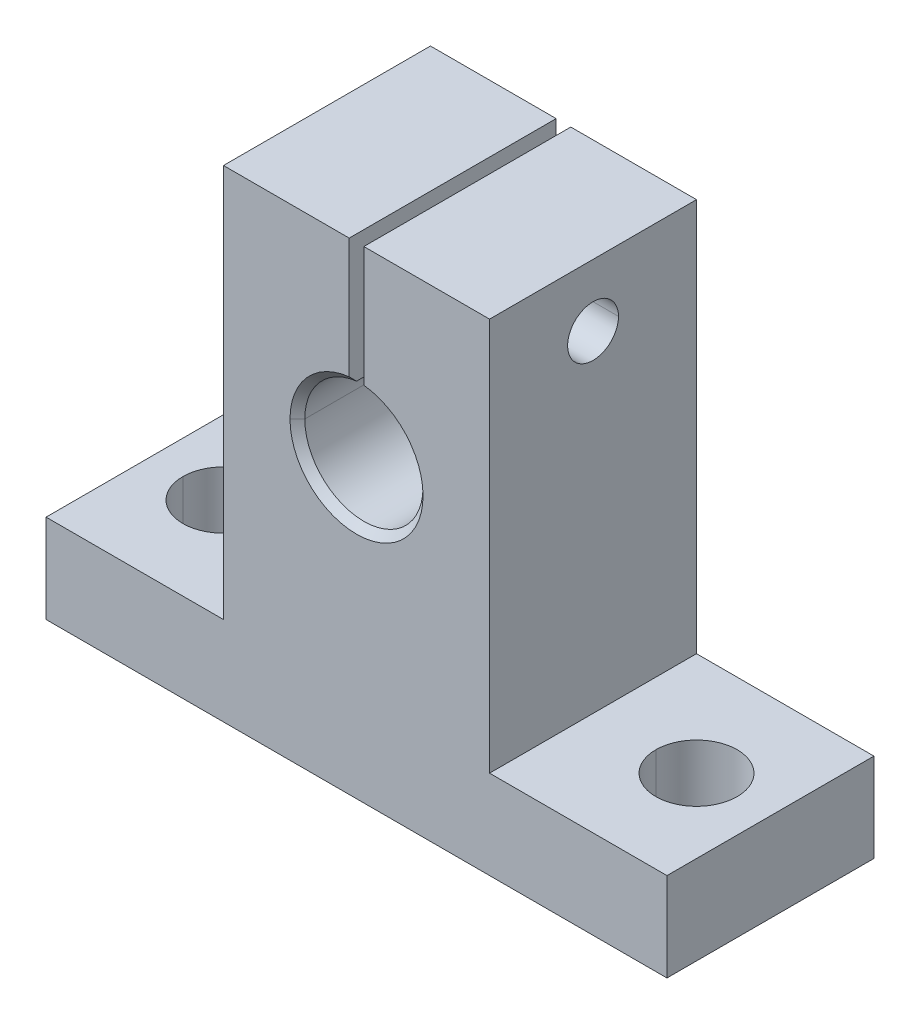
ISO-10303-21;
HEADER;
FILE_DESCRIPTION(('STEP AP214'),'2;1');
FILE_NAME('part.step','',(''),(''),'','','');
FILE_SCHEMA(('AUTOMOTIVE_DESIGN { 1 0 10303 214 1 1 1 1 }'));
ENDSEC;
DATA;
#1=APPLICATION_CONTEXT('core data for automotive mechanical design processes');
#2=APPLICATION_PROTOCOL_DEFINITION('international standard','automotive_design',2000,#1);
#3=PRODUCT_CONTEXT('',#1,'mechanical');
#4=PRODUCT('Part','Part','',(#3));
#5=PRODUCT_RELATED_PRODUCT_CATEGORY('part','',(#4));
#6=PRODUCT_DEFINITION_FORMATION('','',#4);
#7=PRODUCT_DEFINITION_CONTEXT('part definition',#1,'design');
#8=PRODUCT_DEFINITION('design','',#6,#7);
#9=PRODUCT_DEFINITION_SHAPE('','',#8);
#10=(LENGTH_UNIT() NAMED_UNIT(*) SI_UNIT(.MILLI.,.METRE.));
#11=(NAMED_UNIT(*) PLANE_ANGLE_UNIT() SI_UNIT($,.RADIAN.));
#12=(NAMED_UNIT(*) SI_UNIT($,.STERADIAN.) SOLID_ANGLE_UNIT());
#13=UNCERTAINTY_MEASURE_WITH_UNIT(LENGTH_MEASURE(1.E-05),#10,'distance_accuracy_value','');
#14=(GEOMETRIC_REPRESENTATION_CONTEXT(3) GLOBAL_UNCERTAINTY_ASSIGNED_CONTEXT((#13)) GLOBAL_UNIT_ASSIGNED_CONTEXT((#10,
#11,#12)) REPRESENTATION_CONTEXT('',''));
#15=CARTESIAN_POINT('',(0.,0.,0.));
#16=DIRECTION('',(0.,0.,1.));
#17=DIRECTION('',(1.,0.,0.));
#18=AXIS2_PLACEMENT_3D('',#15,#16,#17);
#19=CARTESIAN_POINT('',(0.,1.4,7.));
#20=DIRECTION('',(0.,0.,1.));
#21=DIRECTION('',(1.,0.,0.));
#22=AXIS2_PLACEMENT_3D('',#19,#20,#21);
#23=CONICAL_SURFACE('',#22,4.5,0.785398163397448);
#24=DIRECTION('',(-0.707106781186548,0.,0.707106781186548));
#25=VECTOR('',#24,1.);
#26=CARTESIAN_POINT('',(-4.5,1.4,7.));
#27=LINE('',#26,#25);
#28=CARTESIAN_POINT('',(-4.,1.4,6.5));
#29=VERTEX_POINT('',#28);
#30=CARTESIAN_POINT('',(-4.5,1.4,7.));
#31=VERTEX_POINT('',#30);
#32=EDGE_CURVE('E366',#29,#31,#27,.T.);
#33=ORIENTED_EDGE('',*,*,#32,.F.);
#34=CARTESIAN_POINT('',(0.,1.4,6.5));
#35=DIRECTION('',(0.,0.,1.));
#36=DIRECTION('',(1.,0.,0.));
#37=AXIS2_PLACEMENT_3D('',#34,#35,#36);
#38=CIRCLE('',#37,4.);
#39=CARTESIAN_POINT('',(-0.495,5.36925370819251,6.5));
#40=VERTEX_POINT('',#39);
#41=EDGE_CURVE('E350',#40,#29,#38,.T.);
#42=ORIENTED_EDGE('',*,*,#41,.F.);
#43=CARTESIAN_POINT('',(-0.495,5.87269214232322,7.));
#44=CARTESIAN_POINT('',(-0.495,5.70494321109334,6.83326903853444));
#45=CARTESIAN_POINT('',(-0.495,5.53713841340918,6.66659424718253));
#46=CARTESIAN_POINT('',(-0.495,5.36925370819251,6.5));
#47=(BOUNDED_CURVE() B_SPLINE_CURVE(3,(#43,#44,#45,#46),.UNSPECIFIED.,.F.,
.F.) B_SPLINE_CURVE_WITH_KNOTS((4,4),(0.,0.000709542286942768),
.UNSPECIFIED.) CURVE() GEOMETRIC_REPRESENTATION_ITEM() RATIONAL_B_SPLINE_CURVE((1.,1.,1.,1.)) REPRESENTATION_ITEM(''));
#48=CARTESIAN_POINT('',(-0.495,5.87269214232322,7.));
#49=VERTEX_POINT('',#48);
#50=EDGE_CURVE('E352',#49,#40,#47,.T.);
#51=ORIENTED_EDGE('',*,*,#50,.F.);
#52=CARTESIAN_POINT('',(0.,1.4,7.));
#53=DIRECTION('',(0.,0.,-1.));
#54=DIRECTION('',(1.,0.,0.));
#55=AXIS2_PLACEMENT_3D('',#52,#53,#54);
#56=CIRCLE('',#55,4.5);
#57=EDGE_CURVE('E44',#31,#49,#56,.T.);
#58=ORIENTED_EDGE('',*,*,#57,.F.);
#59=EDGE_LOOP('',(#33,#42,#51,#58));
#60=FACE_BOUND('',#59,.T.);
#61=ADVANCED_FACE('F16',(#60),#23,.F.);
#62=CARTESIAN_POINT('',(0.,1.4,-6.5));
#63=DIRECTION('',(0.,0.,-1.));
#64=DIRECTION('',(-1.,0.,0.));
#65=AXIS2_PLACEMENT_3D('',#62,#63,#64);
#66=CONICAL_SURFACE('',#65,4.,0.785398163397448);
#67=DIRECTION('',(0.707106781186548,0.,-0.707106781186548));
#68=VECTOR('',#67,1.);
#69=CARTESIAN_POINT('',(4.,1.4,-6.5));
#70=LINE('',#69,#68);
#71=CARTESIAN_POINT('',(4.,1.4,-6.5));
#72=VERTEX_POINT('',#71);
#73=CARTESIAN_POINT('',(4.5,1.4,-7.));
#74=VERTEX_POINT('',#73);
#75=EDGE_CURVE('E411',#72,#74,#70,.T.);
#76=ORIENTED_EDGE('',*,*,#75,.F.);
#77=CARTESIAN_POINT('',(0.,1.4,-6.5));
#78=DIRECTION('',(0.,0.,-1.));
#79=DIRECTION('',(1.,0.,0.));
#80=AXIS2_PLACEMENT_3D('',#77,#78,#79);
#81=CIRCLE('',#80,4.);
#82=CARTESIAN_POINT('',(0.495,5.36925370819251,-6.5));
#83=VERTEX_POINT('',#82);
#84=EDGE_CURVE('E345',#83,#72,#81,.T.);
#85=ORIENTED_EDGE('',*,*,#84,.F.);
#86=CARTESIAN_POINT('',(0.495,5.87269214232323,-7.));
#87=CARTESIAN_POINT('',(0.495,5.70494321109335,-6.83326903853444));
#88=CARTESIAN_POINT('',(0.495,5.53713841340918,-6.66659424718252));
#89=CARTESIAN_POINT('',(0.495,5.36925370819251,-6.5));
#90=(BOUNDED_CURVE() B_SPLINE_CURVE(3,(#86,#87,#88,#89),.UNSPECIFIED.,.F.,
.F.) B_SPLINE_CURVE_WITH_KNOTS((4,4),(0.,0.000709542286942788),
.UNSPECIFIED.) CURVE() GEOMETRIC_REPRESENTATION_ITEM() RATIONAL_B_SPLINE_CURVE((1.,1.,1.,1.)) REPRESENTATION_ITEM(''));
#91=CARTESIAN_POINT('',(0.495,5.87269214232323,-7.));
#92=VERTEX_POINT('',#91);
#93=EDGE_CURVE('E472',#92,#83,#90,.T.);
#94=ORIENTED_EDGE('',*,*,#93,.F.);
#95=CARTESIAN_POINT('',(0.,1.4,-7.));
#96=DIRECTION('',(0.,0.,1.));
#97=DIRECTION('',(1.,0.,0.));
#98=AXIS2_PLACEMENT_3D('',#95,#96,#97);
#99=CIRCLE('',#98,4.5);
#100=EDGE_CURVE('E486',#74,#92,#99,.T.);
#101=ORIENTED_EDGE('',*,*,#100,.F.);
#102=EDGE_LOOP('',(#76,#85,#94,#101));
#103=FACE_BOUND('',#102,.T.);
#104=ADVANCED_FACE('F615',(#103),#66,.F.);
#105=CARTESIAN_POINT('',(16.,-18.601,0.));
#106=DIRECTION('',(0.,1.,0.));
#107=DIRECTION('',(-1.,0.,0.));
#108=AXIS2_PLACEMENT_3D('',#105,#106,#107);
#109=CYLINDRICAL_SURFACE('',#108,2.75);
#110=DIRECTION('',(0.,1.,0.));
#111=VECTOR('',#110,1.);
#112=CARTESIAN_POINT('',(18.75,-18.601,0.));
#113=LINE('',#112,#111);
#114=CARTESIAN_POINT('',(18.75,-18.6,0.));
#115=VERTEX_POINT('',#114);
#116=CARTESIAN_POINT('',(18.75,-12.6,0.));
#117=VERTEX_POINT('',#116);
#118=EDGE_CURVE('E379',#115,#117,#113,.T.);
#119=ORIENTED_EDGE('',*,*,#118,.F.);
#120=CARTESIAN_POINT('',(16.,-18.6,0.));
#121=DIRECTION('',(0.,-1.,0.));
#122=DIRECTION('',(0.,0.,1.));
#123=AXIS2_PLACEMENT_3D('',#120,#121,#122);
#124=CIRCLE('',#123,2.75);
#125=CARTESIAN_POINT('',(13.25,-18.6,0.));
#126=VERTEX_POINT('',#125);
#127=EDGE_CURVE('E93',#115,#126,#124,.T.);
#128=ORIENTED_EDGE('',*,*,#127,.T.);
#129=DIRECTION('',(0.,1.,0.));
#130=VECTOR('',#129,1.);
#131=CARTESIAN_POINT('',(13.25,-18.601,0.));
#132=LINE('',#131,#130);
#133=CARTESIAN_POINT('',(13.25,-12.6,0.));
#134=VERTEX_POINT('',#133);
#135=EDGE_CURVE('E532',#126,#134,#132,.T.);
#136=ORIENTED_EDGE('',*,*,#135,.T.);
#137=CARTESIAN_POINT('',(16.,-12.6,0.));
#138=DIRECTION('',(0.,1.,0.));
#139=DIRECTION('',(1.,0.,0.));
#140=AXIS2_PLACEMENT_3D('',#137,#138,#139);
#141=CIRCLE('',#140,2.75);
#142=EDGE_CURVE('E77',#134,#117,#141,.T.);
#143=ORIENTED_EDGE('',*,*,#142,.T.);
#144=EDGE_LOOP('',(#119,#128,#136,#143));
#145=FACE_BOUND('',#144,.T.);
#146=ADVANCED_FACE('F1119',(#145),#109,.F.);
#147=CARTESIAN_POINT('',(-16.,-18.601,0.));
#148=DIRECTION('',(0.,1.,0.));
#149=DIRECTION('',(-1.,0.,0.));
#150=AXIS2_PLACEMENT_3D('',#147,#148,#149);
#151=CYLINDRICAL_SURFACE('',#150,2.75);
#152=DIRECTION('',(0.,1.,0.));
#153=VECTOR('',#152,1.);
#154=CARTESIAN_POINT('',(-13.25,-18.601,0.));
#155=LINE('',#154,#153);
#156=CARTESIAN_POINT('',(-13.25,-18.6,0.));
#157=VERTEX_POINT('',#156);
#158=CARTESIAN_POINT('',(-13.25,-12.6,0.));
#159=VERTEX_POINT('',#158);
#160=EDGE_CURVE('E303',#157,#159,#155,.T.);
#161=ORIENTED_EDGE('',*,*,#160,.F.);
#162=CARTESIAN_POINT('',(-16.,-18.6,0.));
#163=DIRECTION('',(0.,-1.,0.));
#164=DIRECTION('',(0.,0.,1.));
#165=AXIS2_PLACEMENT_3D('',#162,#163,#164);
#166=CIRCLE('',#165,2.75);
#167=CARTESIAN_POINT('',(-18.75,-18.6,0.));
#168=VERTEX_POINT('',#167);
#169=EDGE_CURVE('E295',#157,#168,#166,.T.);
#170=ORIENTED_EDGE('',*,*,#169,.T.);
#171=DIRECTION('',(0.,1.,0.));
#172=VECTOR('',#171,1.);
#173=CARTESIAN_POINT('',(-18.75,-18.601,0.));
#174=LINE('',#173,#172);
#175=CARTESIAN_POINT('',(-18.75,-12.6,0.));
#176=VERTEX_POINT('',#175);
#177=EDGE_CURVE('E293',#168,#176,#174,.T.);
#178=ORIENTED_EDGE('',*,*,#177,.T.);
#179=CARTESIAN_POINT('',(-16.,-12.6,0.));
#180=DIRECTION('',(0.,1.,0.));
#181=DIRECTION('',(-1.,0.,0.));
#182=AXIS2_PLACEMENT_3D('',#179,#180,#181);
#183=CIRCLE('',#182,2.75);
#184=EDGE_CURVE('E279',#176,#159,#183,.T.);
#185=ORIENTED_EDGE('',*,*,#184,.T.);
#186=EDGE_LOOP('',(#161,#170,#178,#185));
#187=FACE_BOUND('',#186,.T.);
#188=ADVANCED_FACE('F294',(#187),#151,.F.);
#189=CARTESIAN_POINT('',(-4.34108074635992,9.8,0.));
#190=DIRECTION('',(-1.,0.,0.));
#191=DIRECTION('',(0.,0.,1.));
#192=AXIS2_PLACEMENT_3D('',#189,#190,#191);
#193=CYLINDRICAL_SURFACE('',#192,1.72);
#194=DIRECTION('',(-1.,0.,0.));
#195=VECTOR('',#194,1.);
#196=CARTESIAN_POINT('',(-4.34108074635992,9.8,-1.72));
#197=LINE('',#196,#195);
#198=CARTESIAN_POINT('',(9.,9.8,-1.72));
#199=VERTEX_POINT('',#198);
#200=CARTESIAN_POINT('',(0.495,9.8,-1.72));
#201=VERTEX_POINT('',#200);
#202=EDGE_CURVE('E510',#199,#201,#197,.T.);
#203=ORIENTED_EDGE('',*,*,#202,.F.);
#204=CARTESIAN_POINT('',(9.,9.8,0.));
#205=DIRECTION('',(-1.,0.,0.));
#206=DIRECTION('',(0.,0.,1.));
#207=AXIS2_PLACEMENT_3D('',#204,#205,#206);
#208=CIRCLE('',#207,1.72);
#209=CARTESIAN_POINT('',(9.,9.8,1.72));
#210=VERTEX_POINT('',#209);
#211=EDGE_CURVE('E190',#210,#199,#208,.T.);
#212=ORIENTED_EDGE('',*,*,#211,.F.);
#213=DIRECTION('',(-1.,0.,0.));
#214=VECTOR('',#213,1.);
#215=CARTESIAN_POINT('',(-4.34108074635992,9.8,1.72));
#216=LINE('',#215,#214);
#217=CARTESIAN_POINT('',(0.495,9.8,1.72));
#218=VERTEX_POINT('',#217);
#219=EDGE_CURVE('E402',#210,#218,#216,.T.);
#220=ORIENTED_EDGE('',*,*,#219,.T.);
#221=CARTESIAN_POINT('',(0.495,9.8,0.));
#222=DIRECTION('',(1.,0.,0.));
#223=DIRECTION('',(0.,0.,-1.));
#224=AXIS2_PLACEMENT_3D('',#221,#222,#223);
#225=CIRCLE('',#224,1.72);
#226=EDGE_CURVE('E178',#201,#218,#225,.T.);
#227=ORIENTED_EDGE('',*,*,#226,.F.);
#228=EDGE_LOOP('',(#203,#212,#220,#227));
#229=FACE_BOUND('',#228,.T.);
#230=ADVANCED_FACE('F1118',(#229),#193,.F.);
#231=CARTESIAN_POINT('',(-4.34108074635992,9.8,0.));
#232=DIRECTION('',(-1.,0.,0.));
#233=DIRECTION('',(0.,0.,1.));
#234=AXIS2_PLACEMENT_3D('',#231,#232,#233);
#235=CYLINDRICAL_SURFACE('',#234,1.72);
#236=DIRECTION('',(-1.,0.,0.));
#237=VECTOR('',#236,1.);
#238=CARTESIAN_POINT('',(-4.34108074635992,9.8,-1.72));
#239=LINE('',#238,#237);
#240=CARTESIAN_POINT('',(-0.495,9.8,-1.72));
#241=VERTEX_POINT('',#240);
#242=CARTESIAN_POINT('',(-5.,9.8,-1.72));
#243=VERTEX_POINT('',#242);
#244=EDGE_CURVE('E401',#241,#243,#239,.T.);
#245=ORIENTED_EDGE('',*,*,#244,.F.);
#246=CARTESIAN_POINT('',(-0.495,9.8,0.));
#247=DIRECTION('',(-1.,0.,0.));
#248=DIRECTION('',(0.,0.,1.));
#249=AXIS2_PLACEMENT_3D('',#246,#247,#248);
#250=CIRCLE('',#249,1.72);
#251=CARTESIAN_POINT('',(-0.495,9.8,1.72));
#252=VERTEX_POINT('',#251);
#253=EDGE_CURVE('E357',#252,#241,#250,.T.);
#254=ORIENTED_EDGE('',*,*,#253,.F.);
#255=DIRECTION('',(-1.,0.,0.));
#256=VECTOR('',#255,1.);
#257=CARTESIAN_POINT('',(-4.34108074635992,9.8,1.72));
#258=LINE('',#257,#256);
#259=CARTESIAN_POINT('',(-5.,9.8,1.72));
#260=VERTEX_POINT('',#259);
#261=EDGE_CURVE('E316',#252,#260,#258,.T.);
#262=ORIENTED_EDGE('',*,*,#261,.T.);
#263=CARTESIAN_POINT('',(-5.,9.8,0.));
#264=DIRECTION('',(-1.,0.,0.));
#265=DIRECTION('',(0.,0.,1.));
#266=AXIS2_PLACEMENT_3D('',#263,#264,#265);
#267=CIRCLE('',#266,1.72);
#268=EDGE_CURVE('E10',#260,#243,#267,.T.);
#269=ORIENTED_EDGE('',*,*,#268,.T.);
#270=EDGE_LOOP('',(#245,#254,#262,#269));
#271=FACE_BOUND('',#270,.T.);
#272=ADVANCED_FACE('F1159',(#271),#235,.F.);
#273=CARTESIAN_POINT('',(-5.,0.,0.));
#274=DIRECTION('',(1.,0.,0.));
#275=DIRECTION('',(0.,1.,0.));
#276=AXIS2_PLACEMENT_3D('',#273,#274,#275);
#277=PLANE('',#276);
#278=ORIENTED_EDGE('',*,*,#268,.F.);
#279=CARTESIAN_POINT('',(-5.,9.8,0.));
#280=DIRECTION('',(-1.,0.,0.));
#281=DIRECTION('',(0.,0.,1.));
#282=AXIS2_PLACEMENT_3D('',#279,#280,#281);
#283=CIRCLE('',#282,1.72);
#284=EDGE_CURVE('E321',#243,#260,#283,.T.);
#285=ORIENTED_EDGE('',*,*,#284,.F.);
#286=EDGE_LOOP('',(#278,#285));
#287=FACE_BOUND('',#286,.T.);
#288=CARTESIAN_POINT('',(-5.,9.8,0.));
#289=DIRECTION('',(-1.,0.,0.));
#290=DIRECTION('',(0.,0.,1.));
#291=AXIS2_PLACEMENT_3D('',#288,#289,#290);
#292=CIRCLE('',#291,3.2);
#293=CARTESIAN_POINT('',(-5.,9.8,3.2));
#294=VERTEX_POINT('',#293);
#295=CARTESIAN_POINT('',(-5.,9.8,-3.2));
#296=VERTEX_POINT('',#295);
#297=EDGE_CURVE('E29',#294,#296,#292,.T.);
#298=ORIENTED_EDGE('',*,*,#297,.T.);
#299=CARTESIAN_POINT('',(-5.,9.8,0.));
#300=DIRECTION('',(-1.,0.,0.));
#301=DIRECTION('',(0.,0.,1.));
#302=AXIS2_PLACEMENT_3D('',#299,#300,#301);
#303=CIRCLE('',#302,3.2);
#304=EDGE_CURVE('E320',#296,#294,#303,.T.);
#305=ORIENTED_EDGE('',*,*,#304,.T.);
#306=EDGE_LOOP('',(#298,#305));
#307=FACE_BOUND('',#306,.T.);
#308=ADVANCED_FACE('F1045',(#287,#307),#277,.F.);
#309=CARTESIAN_POINT('',(-4.34108074635992,9.8,0.));
#310=DIRECTION('',(-1.,0.,0.));
#311=DIRECTION('',(0.,0.,1.));
#312=AXIS2_PLACEMENT_3D('',#309,#310,#311);
#313=CYLINDRICAL_SURFACE('',#312,3.2);
#314=DIRECTION('',(-1.,0.,0.));
#315=VECTOR('',#314,1.);
#316=CARTESIAN_POINT('',(-4.34108074635992,9.8,-3.2));
#317=LINE('',#316,#315);
#318=CARTESIAN_POINT('',(-9.,9.8,-3.2));
#319=VERTEX_POINT('',#318);
#320=EDGE_CURVE('E461',#296,#319,#317,.T.);
#321=ORIENTED_EDGE('',*,*,#320,.F.);
#322=ORIENTED_EDGE('',*,*,#297,.F.);
#323=DIRECTION('',(-1.,0.,0.));
#324=VECTOR('',#323,1.);
#325=CARTESIAN_POINT('',(-4.34108074635992,9.8,3.2));
#326=LINE('',#325,#324);
#327=CARTESIAN_POINT('',(-9.,9.8,3.2));
#328=VERTEX_POINT('',#327);
#329=EDGE_CURVE('E406',#294,#328,#326,.T.);
#330=ORIENTED_EDGE('',*,*,#329,.T.);
#331=CARTESIAN_POINT('',(-9.,9.8,0.));
#332=DIRECTION('',(-1.,0.,0.));
#333=DIRECTION('',(0.,0.,1.));
#334=AXIS2_PLACEMENT_3D('',#331,#332,#333);
#335=CIRCLE('',#334,3.2);
#336=EDGE_CURVE('E388',#328,#319,#335,.T.);
#337=ORIENTED_EDGE('',*,*,#336,.T.);
#338=EDGE_LOOP('',(#321,#322,#330,#337));
#339=FACE_BOUND('',#338,.T.);
#340=ADVANCED_FACE('F1041',(#339),#313,.F.);
#341=CARTESIAN_POINT('',(0.,1.4,-7.));
#342=DIRECTION('',(0.,0.,1.));
#343=DIRECTION('',(1.,0.,0.));
#344=AXIS2_PLACEMENT_3D('',#341,#342,#343);
#345=PLANE('',#344);
#346=DIRECTION('',(0.,1.,0.));
#347=VECTOR('',#346,1.);
#348=CARTESIAN_POINT('',(-0.495,5.36925370819251,-7.));
#349=LINE('',#348,#347);
#350=CARTESIAN_POINT('',(-0.495,5.87269214232323,-7.));
#351=VERTEX_POINT('',#350);
#352=CARTESIAN_POINT('',(-0.495,14.,-7.));
#353=VERTEX_POINT('',#352);
#354=EDGE_CURVE('E420',#351,#353,#349,.T.);
#355=ORIENTED_EDGE('',*,*,#354,.F.);
#356=CARTESIAN_POINT('',(0.,1.4,-7.));
#357=DIRECTION('',(0.,0.,1.));
#358=DIRECTION('',(1.,0.,0.));
#359=AXIS2_PLACEMENT_3D('',#356,#357,#358);
#360=CIRCLE('',#359,4.5);
#361=CARTESIAN_POINT('',(-4.5,1.4,-7.));
#362=VERTEX_POINT('',#361);
#363=EDGE_CURVE('E440',#351,#362,#360,.T.);
#364=ORIENTED_EDGE('',*,*,#363,.T.);
#365=CARTESIAN_POINT('',(0.,1.4,-7.));
#366=DIRECTION('',(0.,0.,1.));
#367=DIRECTION('',(1.,0.,0.));
#368=AXIS2_PLACEMENT_3D('',#365,#366,#367);
#369=CIRCLE('',#368,4.5);
#370=EDGE_CURVE('E415',#362,#74,#369,.T.);
#371=ORIENTED_EDGE('',*,*,#370,.T.);
#372=ORIENTED_EDGE('',*,*,#100,.T.);
#373=DIRECTION('',(0.,-1.,0.));
#374=VECTOR('',#373,1.);
#375=CARTESIAN_POINT('',(0.495,5.36925370819251,-7.));
#376=LINE('',#375,#374);
#377=CARTESIAN_POINT('',(0.495,14.,-7.));
#378=VERTEX_POINT('',#377);
#379=EDGE_CURVE('E479',#378,#92,#376,.T.);
#380=ORIENTED_EDGE('',*,*,#379,.F.);
#381=DIRECTION('',(-1.,0.,0.));
#382=VECTOR('',#381,1.);
#383=CARTESIAN_POINT('',(0.495,14.,-7.));
#384=LINE('',#383,#382);
#385=CARTESIAN_POINT('',(9.,14.,-7.));
#386=VERTEX_POINT('',#385);
#387=EDGE_CURVE('E449',#386,#378,#384,.T.);
#388=ORIENTED_EDGE('',*,*,#387,.F.);
#389=DIRECTION('',(0.,1.,0.));
#390=VECTOR('',#389,1.);
#391=CARTESIAN_POINT('',(9.,14.,-7.));
#392=LINE('',#391,#390);
#393=CARTESIAN_POINT('',(9.,-12.6,-7.));
#394=VERTEX_POINT('',#393);
#395=EDGE_CURVE('E409',#394,#386,#392,.T.);
#396=ORIENTED_EDGE('',*,*,#395,.F.);
#397=DIRECTION('',(-1.,0.,0.));
#398=VECTOR('',#397,1.);
#399=CARTESIAN_POINT('',(9.,-12.6,-7.));
#400=LINE('',#399,#398);
#401=CARTESIAN_POINT('',(21.,-12.6,-7.));
#402=VERTEX_POINT('',#401);
#403=EDGE_CURVE('E338',#402,#394,#400,.T.);
#404=ORIENTED_EDGE('',*,*,#403,.F.);
#405=DIRECTION('',(0.,1.,0.));
#406=VECTOR('',#405,1.);
#407=CARTESIAN_POINT('',(21.,-18.6,-7.));
#408=LINE('',#407,#406);
#409=CARTESIAN_POINT('',(21.,-18.6,-7.));
#410=VERTEX_POINT('',#409);
#411=EDGE_CURVE('E327',#410,#402,#408,.T.);
#412=ORIENTED_EDGE('',*,*,#411,.F.);
#413=DIRECTION('',(1.,0.,0.));
#414=VECTOR('',#413,1.);
#415=CARTESIAN_POINT('',(-21.,-18.6,-7.));
#416=LINE('',#415,#414);
#417=CARTESIAN_POINT('',(-21.,-18.6,-7.));
#418=VERTEX_POINT('',#417);
#419=EDGE_CURVE('E457',#418,#410,#416,.T.);
#420=ORIENTED_EDGE('',*,*,#419,.F.);
#421=DIRECTION('',(0.,-1.,0.));
#422=VECTOR('',#421,1.);
#423=CARTESIAN_POINT('',(-21.,-18.6,-7.));
#424=LINE('',#423,#422);
#425=CARTESIAN_POINT('',(-21.,-12.6,-7.));
#426=VERTEX_POINT('',#425);
#427=EDGE_CURVE('E289',#426,#418,#424,.T.);
#428=ORIENTED_EDGE('',*,*,#427,.F.);
#429=DIRECTION('',(-1.,0.,0.));
#430=VECTOR('',#429,1.);
#431=CARTESIAN_POINT('',(-9.,-12.6,-7.));
#432=LINE('',#431,#430);
#433=CARTESIAN_POINT('',(-9.,-12.6,-7.));
#434=VERTEX_POINT('',#433);
#435=EDGE_CURVE('E390',#434,#426,#432,.T.);
#436=ORIENTED_EDGE('',*,*,#435,.F.);
#437=DIRECTION('',(0.,-1.,0.));
#438=VECTOR('',#437,1.);
#439=CARTESIAN_POINT('',(-9.,14.,-7.));
#440=LINE('',#439,#438);
#441=CARTESIAN_POINT('',(-9.,14.,-7.));
#442=VERTEX_POINT('',#441);
#443=EDGE_CURVE('E328',#442,#434,#440,.T.);
#444=ORIENTED_EDGE('',*,*,#443,.F.);
#445=DIRECTION('',(-1.,0.,0.));
#446=VECTOR('',#445,1.);
#447=CARTESIAN_POINT('',(-9.,14.,-7.));
#448=LINE('',#447,#446);
#449=EDGE_CURVE('E367',#353,#442,#448,.T.);
#450=ORIENTED_EDGE('',*,*,#449,.F.);
#451=EDGE_LOOP('',(#355,#364,#371,#372,#380,#388,#396,#404,#412,#420,#428,#436,#444,#450));
#452=FACE_BOUND('',#451,.T.);
#453=ADVANCED_FACE('F604',(#452),#345,.F.);
#454=CARTESIAN_POINT('',(0.,1.4,7.));
#455=DIRECTION('',(0.,0.,1.));
#456=DIRECTION('',(1.,0.,0.));
#457=AXIS2_PLACEMENT_3D('',#454,#455,#456);
#458=PLANE('',#457);
#459=DIRECTION('',(0.,-1.,0.));
#460=VECTOR('',#459,1.);
#461=CARTESIAN_POINT('',(0.495,5.36925370819251,7.));
#462=LINE('',#461,#460);
#463=CARTESIAN_POINT('',(0.495,14.,7.));
#464=VERTEX_POINT('',#463);
#465=CARTESIAN_POINT('',(0.495,5.87269214232322,7.));
#466=VERTEX_POINT('',#465);
#467=EDGE_CURVE('E346',#464,#466,#462,.T.);
#468=ORIENTED_EDGE('',*,*,#467,.T.);
#469=CARTESIAN_POINT('',(0.,1.4,7.));
#470=DIRECTION('',(0.,0.,-1.));
#471=DIRECTION('',(1.,0.,0.));
#472=AXIS2_PLACEMENT_3D('',#469,#470,#471);
#473=CIRCLE('',#472,4.5);
#474=CARTESIAN_POINT('',(4.5,1.4,7.));
#475=VERTEX_POINT('',#474);
#476=EDGE_CURVE('E425',#466,#475,#473,.T.);
#477=ORIENTED_EDGE('',*,*,#476,.T.);
#478=CARTESIAN_POINT('',(0.,1.4,7.));
#479=DIRECTION('',(0.,0.,-1.));
#480=DIRECTION('',(1.,0.,0.));
#481=AXIS2_PLACEMENT_3D('',#478,#479,#480);
#482=CIRCLE('',#481,4.5);
#483=EDGE_CURVE('E314',#475,#31,#482,.T.);
#484=ORIENTED_EDGE('',*,*,#483,.T.);
#485=ORIENTED_EDGE('',*,*,#57,.T.);
#486=DIRECTION('',(0.,1.,0.));
#487=VECTOR('',#486,1.);
#488=CARTESIAN_POINT('',(-0.495,5.36925370819251,7.));
#489=LINE('',#488,#487);
#490=CARTESIAN_POINT('',(-0.495,14.,7.));
#491=VERTEX_POINT('',#490);
#492=EDGE_CURVE('E358',#49,#491,#489,.T.);
#493=ORIENTED_EDGE('',*,*,#492,.T.);
#494=DIRECTION('',(-1.,0.,0.));
#495=VECTOR('',#494,1.);
#496=CARTESIAN_POINT('',(-9.,14.,7.));
#497=LINE('',#496,#495);
#498=CARTESIAN_POINT('',(-9.,14.,7.));
#499=VERTEX_POINT('',#498);
#500=EDGE_CURVE('E370',#491,#499,#497,.T.);
#501=ORIENTED_EDGE('',*,*,#500,.T.);
#502=DIRECTION('',(0.,-1.,0.));
#503=VECTOR('',#502,1.);
#504=CARTESIAN_POINT('',(-9.,14.,7.));
#505=LINE('',#504,#503);
#506=CARTESIAN_POINT('',(-9.,-12.6,7.));
#507=VERTEX_POINT('',#506);
#508=EDGE_CURVE('E393',#499,#507,#505,.T.);
#509=ORIENTED_EDGE('',*,*,#508,.T.);
#510=DIRECTION('',(-1.,0.,0.));
#511=VECTOR('',#510,1.);
#512=CARTESIAN_POINT('',(-9.,-12.6,7.));
#513=LINE('',#512,#511);
#514=CARTESIAN_POINT('',(-21.,-12.6,7.));
#515=VERTEX_POINT('',#514);
#516=EDGE_CURVE('E290',#507,#515,#513,.T.);
#517=ORIENTED_EDGE('',*,*,#516,.T.);
#518=DIRECTION('',(0.,-1.,0.));
#519=VECTOR('',#518,1.);
#520=CARTESIAN_POINT('',(-21.,-18.6,7.));
#521=LINE('',#520,#519);
#522=CARTESIAN_POINT('',(-21.,-18.6,7.));
#523=VERTEX_POINT('',#522);
#524=EDGE_CURVE('E453',#515,#523,#521,.T.);
#525=ORIENTED_EDGE('',*,*,#524,.T.);
#526=DIRECTION('',(1.,0.,0.));
#527=VECTOR('',#526,1.);
#528=CARTESIAN_POINT('',(-21.,-18.6,7.));
#529=LINE('',#528,#527);
#530=CARTESIAN_POINT('',(21.,-18.6,7.));
#531=VERTEX_POINT('',#530);
#532=EDGE_CURVE('E381',#523,#531,#529,.T.);
#533=ORIENTED_EDGE('',*,*,#532,.T.);
#534=DIRECTION('',(0.,1.,0.));
#535=VECTOR('',#534,1.);
#536=CARTESIAN_POINT('',(21.,-18.6,7.));
#537=LINE('',#536,#535);
#538=CARTESIAN_POINT('',(21.,-12.6,7.));
#539=VERTEX_POINT('',#538);
#540=EDGE_CURVE('E326',#531,#539,#537,.T.);
#541=ORIENTED_EDGE('',*,*,#540,.T.);
#542=DIRECTION('',(-1.,0.,0.));
#543=VECTOR('',#542,1.);
#544=CARTESIAN_POINT('',(9.,-12.6,7.));
#545=LINE('',#544,#543);
#546=CARTESIAN_POINT('',(9.,-12.6,7.));
#547=VERTEX_POINT('',#546);
#548=EDGE_CURVE('E410',#539,#547,#545,.T.);
#549=ORIENTED_EDGE('',*,*,#548,.T.);
#550=DIRECTION('',(0.,1.,0.));
#551=VECTOR('',#550,1.);
#552=CARTESIAN_POINT('',(9.,14.,7.));
#553=LINE('',#552,#551);
#554=CARTESIAN_POINT('',(9.,14.,7.));
#555=VERTEX_POINT('',#554);
#556=EDGE_CURVE('E557',#547,#555,#553,.T.);
#557=ORIENTED_EDGE('',*,*,#556,.T.);
#558=DIRECTION('',(-1.,0.,0.));
#559=VECTOR('',#558,1.);
#560=CARTESIAN_POINT('',(0.495,14.,7.));
#561=LINE('',#560,#559);
#562=EDGE_CURVE('E448',#555,#464,#561,.T.);
#563=ORIENTED_EDGE('',*,*,#562,.T.);
#564=EDGE_LOOP('',(#468,#477,#484,#485,#493,#501,#509,#517,#525,#533,#541,#549,#557,#563));
#565=FACE_BOUND('',#564,.T.);
#566=ADVANCED_FACE('F1068',(#565),#458,.T.);
#567=CARTESIAN_POINT('',(-9.,14.,7.));
#568=DIRECTION('',(0.,-1.,0.));
#569=DIRECTION('',(-1.,0.,0.));
#570=AXIS2_PLACEMENT_3D('',#567,#568,#569);
#571=PLANE('',#570);
#572=ORIENTED_EDGE('',*,*,#449,.T.);
#573=DIRECTION('',(0.,0.,-1.));
#574=VECTOR('',#573,1.);
#575=CARTESIAN_POINT('',(-9.,14.,7.));
#576=LINE('',#575,#574);
#577=EDGE_CURVE('E391',#499,#442,#576,.T.);
#578=ORIENTED_EDGE('',*,*,#577,.F.);
#579=ORIENTED_EDGE('',*,*,#500,.F.);
#580=DIRECTION('',(0.,0.,-1.));
#581=VECTOR('',#580,1.);
#582=CARTESIAN_POINT('',(-0.495,14.,7.));
#583=LINE('',#582,#581);
#584=EDGE_CURVE('E424',#491,#353,#583,.T.);
#585=ORIENTED_EDGE('',*,*,#584,.T.);
#586=EDGE_LOOP('',(#572,#578,#579,#585));
#587=FACE_BOUND('',#586,.T.);
#588=ADVANCED_FACE('F647',(#587),#571,.F.);
#589=CARTESIAN_POINT('',(-0.495,5.36925370819251,7.));
#590=DIRECTION('',(-1.,0.,0.));
#591=DIRECTION('',(0.,0.,1.));
#592=AXIS2_PLACEMENT_3D('',#589,#590,#591);
#593=PLANE('',#592);
#594=ORIENTED_EDGE('',*,*,#253,.T.);
#595=CARTESIAN_POINT('',(-0.495,9.8,0.));
#596=DIRECTION('',(-1.,0.,0.));
#597=DIRECTION('',(0.,0.,1.));
#598=AXIS2_PLACEMENT_3D('',#595,#596,#597);
#599=CIRCLE('',#598,1.72);
#600=EDGE_CURVE('E397',#241,#252,#599,.T.);
#601=ORIENTED_EDGE('',*,*,#600,.T.);
#602=EDGE_LOOP('',(#594,#601));
#603=FACE_BOUND('',#602,.T.);
#604=DIRECTION('',(0.,0.,-1.));
#605=VECTOR('',#604,1.);
#606=CARTESIAN_POINT('',(-0.495,5.36925370819251,7.));
#607=LINE('',#606,#605);
#608=CARTESIAN_POINT('',(-0.495,5.36925370819251,-6.5));
#609=VERTEX_POINT('',#608);
#610=EDGE_CURVE('E333',#40,#609,#607,.T.);
#611=ORIENTED_EDGE('',*,*,#610,.T.);
#612=CARTESIAN_POINT('',(-0.495,5.36925370819251,-6.5));
#613=CARTESIAN_POINT('',(-0.495,5.53713841340918,-6.66659424718252));
#614=CARTESIAN_POINT('',(-0.495,5.70494321109335,-6.83326903853444));
#615=CARTESIAN_POINT('',(-0.495,5.87269214232323,-7.));
#616=(BOUNDED_CURVE() B_SPLINE_CURVE(3,(#612,#613,#614,#615),.UNSPECIFIED.,.F.,
.F.) B_SPLINE_CURVE_WITH_KNOTS((4,4),(0.,0.000709542286942788),
.UNSPECIFIED.) CURVE() GEOMETRIC_REPRESENTATION_ITEM() RATIONAL_B_SPLINE_CURVE((1.,1.,1.,1.)) REPRESENTATION_ITEM(''));
#617=EDGE_CURVE('E380',#609,#351,#616,.T.);
#618=ORIENTED_EDGE('',*,*,#617,.T.);
#619=ORIENTED_EDGE('',*,*,#354,.T.);
#620=ORIENTED_EDGE('',*,*,#584,.F.);
#621=ORIENTED_EDGE('',*,*,#492,.F.);
#622=ORIENTED_EDGE('',*,*,#50,.T.);
#623=EDGE_LOOP('',(#611,#618,#619,#620,#621,#622));
#624=FACE_BOUND('',#623,.T.);
#625=ADVANCED_FACE('F651',(#603,#624),#593,.F.);
#626=CARTESIAN_POINT('',(0.,1.4,7.));
#627=DIRECTION('',(0.,0.,-1.));
#628=DIRECTION('',(-1.,0.,0.));
#629=AXIS2_PLACEMENT_3D('',#626,#627,#628);
#630=CYLINDRICAL_SURFACE('',#629,4.);
#631=DIRECTION('',(0.,0.,-1.));
#632=VECTOR('',#631,1.);
#633=CARTESIAN_POINT('',(4.,1.4,7.));
#634=LINE('',#633,#632);
#635=CARTESIAN_POINT('',(4.,1.4,6.5));
#636=VERTEX_POINT('',#635);
#637=EDGE_CURVE('E351',#636,#72,#634,.T.);
#638=ORIENTED_EDGE('',*,*,#637,.F.);
#639=CARTESIAN_POINT('',(0.,1.4,6.5));
#640=DIRECTION('',(0.,0.,1.));
#641=DIRECTION('',(1.,0.,0.));
#642=AXIS2_PLACEMENT_3D('',#639,#640,#641);
#643=CIRCLE('',#642,4.);
#644=CARTESIAN_POINT('',(0.495,5.36925370819251,6.5));
#645=VERTEX_POINT('',#644);
#646=EDGE_CURVE('E428',#636,#645,#643,.T.);
#647=ORIENTED_EDGE('',*,*,#646,.T.);
#648=DIRECTION('',(0.,0.,-1.));
#649=VECTOR('',#648,1.);
#650=CARTESIAN_POINT('',(0.495,5.36925370819251,7.));
#651=LINE('',#650,#649);
#652=EDGE_CURVE('E478',#645,#83,#651,.T.);
#653=ORIENTED_EDGE('',*,*,#652,.T.);
#654=ORIENTED_EDGE('',*,*,#84,.T.);
#655=EDGE_LOOP('',(#638,#647,#653,#654));
#656=FACE_BOUND('',#655,.T.);
#657=ADVANCED_FACE('F663',(#656),#630,.F.);
#658=CARTESIAN_POINT('',(0.495,5.36925370819251,7.));
#659=DIRECTION('',(1.,0.,0.));
#660=DIRECTION('',(0.,1.,0.));
#661=AXIS2_PLACEMENT_3D('',#658,#659,#660);
#662=PLANE('',#661);
#663=CARTESIAN_POINT('',(0.495,9.8,0.));
#664=DIRECTION('',(1.,0.,0.));
#665=DIRECTION('',(0.,0.,-1.));
#666=AXIS2_PLACEMENT_3D('',#663,#664,#665);
#667=CIRCLE('',#666,1.72);
#668=EDGE_CURVE('E514',#218,#201,#667,.T.);
#669=ORIENTED_EDGE('',*,*,#668,.T.);
#670=ORIENTED_EDGE('',*,*,#226,.T.);
#671=EDGE_LOOP('',(#669,#670));
#672=FACE_BOUND('',#671,.T.);
#673=ORIENTED_EDGE('',*,*,#379,.T.);
#674=ORIENTED_EDGE('',*,*,#93,.T.);
#675=ORIENTED_EDGE('',*,*,#652,.F.);
#676=CARTESIAN_POINT('',(0.495,5.36925370819251,6.5));
#677=CARTESIAN_POINT('',(0.495,5.53713841340918,6.66659424718253));
#678=CARTESIAN_POINT('',(0.495,5.70494321109334,6.83326903853444));
#679=CARTESIAN_POINT('',(0.495,5.87269214232322,7.));
#680=(BOUNDED_CURVE() B_SPLINE_CURVE(3,(#676,#677,#678,#679),.UNSPECIFIED.,.F.,
.F.) B_SPLINE_CURVE_WITH_KNOTS((4,4),(0.,0.000709542286942768),
.UNSPECIFIED.) CURVE() GEOMETRIC_REPRESENTATION_ITEM() RATIONAL_B_SPLINE_CURVE((1.,1.,1.,1.)) REPRESENTATION_ITEM(''));
#681=EDGE_CURVE('E20',#645,#466,#680,.T.);
#682=ORIENTED_EDGE('',*,*,#681,.T.);
#683=ORIENTED_EDGE('',*,*,#467,.F.);
#684=DIRECTION('',(0.,0.,-1.));
#685=VECTOR('',#684,1.);
#686=CARTESIAN_POINT('',(0.495,14.,7.));
#687=LINE('',#686,#685);
#688=EDGE_CURVE('E441',#464,#378,#687,.T.);
#689=ORIENTED_EDGE('',*,*,#688,.T.);
#690=EDGE_LOOP('',(#673,#674,#675,#682,#683,#689));
#691=FACE_BOUND('',#690,.T.);
#692=ADVANCED_FACE('F617',(#672,#691),#662,.F.);
#693=CARTESIAN_POINT('',(0.495,14.,7.));
#694=DIRECTION('',(0.,-1.,0.));
#695=DIRECTION('',(0.,0.,-1.));
#696=AXIS2_PLACEMENT_3D('',#693,#694,#695);
#697=PLANE('',#696);
#698=ORIENTED_EDGE('',*,*,#387,.T.);
#699=ORIENTED_EDGE('',*,*,#688,.F.);
#700=ORIENTED_EDGE('',*,*,#562,.F.);
#701=DIRECTION('',(0.,0.,-1.));
#702=VECTOR('',#701,1.);
#703=CARTESIAN_POINT('',(9.,14.,7.));
#704=LINE('',#703,#702);
#705=EDGE_CURVE('E434',#555,#386,#704,.T.);
#706=ORIENTED_EDGE('',*,*,#705,.T.);
#707=EDGE_LOOP('',(#698,#699,#700,#706));
#708=FACE_BOUND('',#707,.T.);
#709=ADVANCED_FACE('F621',(#708),#697,.F.);
#710=CARTESIAN_POINT('',(9.,14.,7.));
#711=DIRECTION('',(-1.,0.,0.));
#712=DIRECTION('',(0.,0.,1.));
#713=AXIS2_PLACEMENT_3D('',#710,#711,#712);
#714=PLANE('',#713);
#715=ORIENTED_EDGE('',*,*,#211,.T.);
#716=CARTESIAN_POINT('',(9.,9.8,0.));
#717=DIRECTION('',(-1.,0.,0.));
#718=DIRECTION('',(0.,0.,1.));
#719=AXIS2_PLACEMENT_3D('',#716,#717,#718);
#720=CIRCLE('',#719,1.72);
#721=EDGE_CURVE('E300',#199,#210,#720,.T.);
#722=ORIENTED_EDGE('',*,*,#721,.T.);
#723=EDGE_LOOP('',(#715,#722));
#724=FACE_BOUND('',#723,.T.);
#725=ORIENTED_EDGE('',*,*,#395,.T.);
#726=ORIENTED_EDGE('',*,*,#705,.F.);
#727=ORIENTED_EDGE('',*,*,#556,.F.);
#728=DIRECTION('',(0.,0.,-1.));
#729=VECTOR('',#728,1.);
#730=CARTESIAN_POINT('',(9.,-12.6,7.));
#731=LINE('',#730,#729);
#732=EDGE_CURVE('E342',#547,#394,#731,.T.);
#733=ORIENTED_EDGE('',*,*,#732,.T.);
#734=EDGE_LOOP('',(#725,#726,#727,#733));
#735=FACE_BOUND('',#734,.T.);
#736=ADVANCED_FACE('F624',(#724,#735),#714,.F.);
#737=CARTESIAN_POINT('',(9.,-12.6,7.));
#738=DIRECTION('',(0.,-1.,0.));
#739=DIRECTION('',(-1.,0.,0.));
#740=AXIS2_PLACEMENT_3D('',#737,#738,#739);
#741=PLANE('',#740);
#742=ORIENTED_EDGE('',*,*,#142,.F.);
#743=CARTESIAN_POINT('',(16.,-12.6,0.));
#744=DIRECTION('',(0.,1.,0.));
#745=DIRECTION('',(1.,0.,0.));
#746=AXIS2_PLACEMENT_3D('',#743,#744,#745);
#747=CIRCLE('',#746,2.75);
#748=EDGE_CURVE('E469',#117,#134,#747,.T.);
#749=ORIENTED_EDGE('',*,*,#748,.F.);
#750=EDGE_LOOP('',(#742,#749));
#751=FACE_BOUND('',#750,.T.);
#752=ORIENTED_EDGE('',*,*,#403,.T.);
#753=ORIENTED_EDGE('',*,*,#732,.F.);
#754=ORIENTED_EDGE('',*,*,#548,.F.);
#755=DIRECTION('',(0.,0.,-1.));
#756=VECTOR('',#755,1.);
#757=CARTESIAN_POINT('',(21.,-12.6,7.));
#758=LINE('',#757,#756);
#759=EDGE_CURVE('E322',#539,#402,#758,.T.);
#760=ORIENTED_EDGE('',*,*,#759,.T.);
#761=EDGE_LOOP('',(#752,#753,#754,#760));
#762=FACE_BOUND('',#761,.T.);
#763=ADVANCED_FACE('F627',(#751,#762),#741,.F.);
#764=CARTESIAN_POINT('',(21.,-18.6,7.));
#765=DIRECTION('',(-1.,0.,0.));
#766=DIRECTION('',(0.,0.,1.));
#767=AXIS2_PLACEMENT_3D('',#764,#765,#766);
#768=PLANE('',#767);
#769=ORIENTED_EDGE('',*,*,#411,.T.);
#770=ORIENTED_EDGE('',*,*,#759,.F.);
#771=ORIENTED_EDGE('',*,*,#540,.F.);
#772=DIRECTION('',(0.,0.,-1.));
#773=VECTOR('',#772,1.);
#774=CARTESIAN_POINT('',(21.,-18.6,7.));
#775=LINE('',#774,#773);
#776=EDGE_CURVE('E385',#531,#410,#775,.T.);
#777=ORIENTED_EDGE('',*,*,#776,.T.);
#778=EDGE_LOOP('',(#769,#770,#771,#777));
#779=FACE_BOUND('',#778,.T.);
#780=ADVANCED_FACE('F631',(#779),#768,.F.);
#781=CARTESIAN_POINT('',(-21.,-18.6,7.));
#782=DIRECTION('',(0.,1.,0.));
#783=DIRECTION('',(1.,0.,0.));
#784=AXIS2_PLACEMENT_3D('',#781,#782,#783);
#785=PLANE('',#784);
#786=CARTESIAN_POINT('',(-16.,-18.6,0.));
#787=DIRECTION('',(0.,-1.,0.));
#788=DIRECTION('',(0.,0.,1.));
#789=AXIS2_PLACEMENT_3D('',#786,#787,#788);
#790=CIRCLE('',#789,2.75);
#791=EDGE_CURVE('E310',#168,#157,#790,.T.);
#792=ORIENTED_EDGE('',*,*,#791,.F.);
#793=ORIENTED_EDGE('',*,*,#169,.F.);
#794=EDGE_LOOP('',(#792,#793));
#795=FACE_BOUND('',#794,.T.);
#796=CARTESIAN_POINT('',(16.,-18.6,0.));
#797=DIRECTION('',(0.,-1.,0.));
#798=DIRECTION('',(0.,0.,1.));
#799=AXIS2_PLACEMENT_3D('',#796,#797,#798);
#800=CIRCLE('',#799,2.75);
#801=EDGE_CURVE('E375',#126,#115,#800,.T.);
#802=ORIENTED_EDGE('',*,*,#801,.F.);
#803=ORIENTED_EDGE('',*,*,#127,.F.);
#804=EDGE_LOOP('',(#802,#803));
#805=FACE_BOUND('',#804,.T.);
#806=ORIENTED_EDGE('',*,*,#419,.T.);
#807=ORIENTED_EDGE('',*,*,#776,.F.);
#808=ORIENTED_EDGE('',*,*,#532,.F.);
#809=DIRECTION('',(0.,0.,-1.));
#810=VECTOR('',#809,1.);
#811=CARTESIAN_POINT('',(-21.,-18.6,7.));
#812=LINE('',#811,#810);
#813=EDGE_CURVE('E374',#523,#418,#812,.T.);
#814=ORIENTED_EDGE('',*,*,#813,.T.);
#815=EDGE_LOOP('',(#806,#807,#808,#814));
#816=FACE_BOUND('',#815,.T.);
#817=ADVANCED_FACE('F634',(#795,#805,#816),#785,.F.);
#818=CARTESIAN_POINT('',(-21.,-18.6,7.));
#819=DIRECTION('',(1.,0.,0.));
#820=DIRECTION('',(0.,1.,0.));
#821=AXIS2_PLACEMENT_3D('',#818,#819,#820);
#822=PLANE('',#821);
#823=ORIENTED_EDGE('',*,*,#427,.T.);
#824=ORIENTED_EDGE('',*,*,#813,.F.);
#825=ORIENTED_EDGE('',*,*,#524,.F.);
#826=DIRECTION('',(0.,0.,-1.));
#827=VECTOR('',#826,1.);
#828=CARTESIAN_POINT('',(-21.,-12.6,7.));
#829=LINE('',#828,#827);
#830=EDGE_CURVE('E336',#515,#426,#829,.T.);
#831=ORIENTED_EDGE('',*,*,#830,.T.);
#832=EDGE_LOOP('',(#823,#824,#825,#831));
#833=FACE_BOUND('',#832,.T.);
#834=ADVANCED_FACE('F638',(#833),#822,.F.);
#835=CARTESIAN_POINT('',(-9.,-12.6,7.));
#836=DIRECTION('',(0.,-1.,0.));
#837=DIRECTION('',(0.,0.,-1.));
#838=AXIS2_PLACEMENT_3D('',#835,#836,#837);
#839=PLANE('',#838);
#840=ORIENTED_EDGE('',*,*,#184,.F.);
#841=CARTESIAN_POINT('',(-16.,-12.6,0.));
#842=DIRECTION('',(0.,1.,0.));
#843=DIRECTION('',(-1.,0.,0.));
#844=AXIS2_PLACEMENT_3D('',#841,#842,#843);
#845=CIRCLE('',#844,2.75);
#846=EDGE_CURVE('E284',#159,#176,#845,.T.);
#847=ORIENTED_EDGE('',*,*,#846,.F.);
#848=EDGE_LOOP('',(#840,#847));
#849=FACE_BOUND('',#848,.T.);
#850=ORIENTED_EDGE('',*,*,#435,.T.);
#851=ORIENTED_EDGE('',*,*,#830,.F.);
#852=ORIENTED_EDGE('',*,*,#516,.F.);
#853=DIRECTION('',(0.,0.,-1.));
#854=VECTOR('',#853,1.);
#855=CARTESIAN_POINT('',(-9.,-12.6,7.));
#856=LINE('',#855,#854);
#857=EDGE_CURVE('E332',#507,#434,#856,.T.);
#858=ORIENTED_EDGE('',*,*,#857,.T.);
#859=EDGE_LOOP('',(#850,#851,#852,#858));
#860=FACE_BOUND('',#859,.T.);
#861=ADVANCED_FACE('F281',(#849,#860),#839,.F.);
#862=CARTESIAN_POINT('',(-9.,14.,7.));
#863=DIRECTION('',(1.,0.,0.));
#864=DIRECTION('',(0.,1.,0.));
#865=AXIS2_PLACEMENT_3D('',#862,#863,#864);
#866=PLANE('',#865);
#867=ORIENTED_EDGE('',*,*,#336,.F.);
#868=CARTESIAN_POINT('',(-9.,9.8,0.));
#869=DIRECTION('',(-1.,0.,0.));
#870=DIRECTION('',(0.,0.,1.));
#871=AXIS2_PLACEMENT_3D('',#868,#869,#870);
#872=CIRCLE('',#871,3.2);
#873=EDGE_CURVE('E465',#319,#328,#872,.T.);
#874=ORIENTED_EDGE('',*,*,#873,.F.);
#875=EDGE_LOOP('',(#867,#874));
#876=FACE_BOUND('',#875,.T.);
#877=ORIENTED_EDGE('',*,*,#443,.T.);
#878=ORIENTED_EDGE('',*,*,#857,.F.);
#879=ORIENTED_EDGE('',*,*,#508,.F.);
#880=ORIENTED_EDGE('',*,*,#577,.T.);
#881=EDGE_LOOP('',(#877,#878,#879,#880));
#882=FACE_BOUND('',#881,.T.);
#883=ADVANCED_FACE('F644',(#876,#882),#866,.F.);
#884=CARTESIAN_POINT('',(0.,1.4,7.));
#885=DIRECTION('',(0.,0.,-1.));
#886=DIRECTION('',(-1.,0.,0.));
#887=AXIS2_PLACEMENT_3D('',#884,#885,#886);
#888=CYLINDRICAL_SURFACE('',#887,4.);
#889=ORIENTED_EDGE('',*,*,#41,.T.);
#890=DIRECTION('',(0.,0.,-1.));
#891=VECTOR('',#890,1.);
#892=CARTESIAN_POINT('',(-4.,1.4,7.));
#893=LINE('',#892,#891);
#894=CARTESIAN_POINT('',(-4.,1.4,-6.5));
#895=VERTEX_POINT('',#894);
#896=EDGE_CURVE('E347',#29,#895,#893,.T.);
#897=ORIENTED_EDGE('',*,*,#896,.T.);
#898=CARTESIAN_POINT('',(0.,1.4,-6.5));
#899=DIRECTION('',(0.,0.,-1.));
#900=DIRECTION('',(1.,0.,0.));
#901=AXIS2_PLACEMENT_3D('',#898,#899,#900);
#902=CIRCLE('',#901,4.);
#903=EDGE_CURVE('E485',#895,#609,#902,.T.);
#904=ORIENTED_EDGE('',*,*,#903,.T.);
#905=ORIENTED_EDGE('',*,*,#610,.F.);
#906=EDGE_LOOP('',(#889,#897,#904,#905));
#907=FACE_BOUND('',#906,.T.);
#908=ADVANCED_FACE('F1107',(#907),#888,.F.);
#909=CARTESIAN_POINT('',(0.,1.4,7.));
#910=DIRECTION('',(0.,0.,-1.));
#911=DIRECTION('',(-1.,0.,0.));
#912=AXIS2_PLACEMENT_3D('',#909,#910,#911);
#913=CYLINDRICAL_SURFACE('',#912,4.);
#914=CARTESIAN_POINT('',(0.,1.4,6.5));
#915=DIRECTION('',(0.,0.,1.));
#916=DIRECTION('',(1.,0.,0.));
#917=AXIS2_PLACEMENT_3D('',#914,#915,#916);
#918=CIRCLE('',#917,4.);
#919=EDGE_CURVE('E359',#29,#636,#918,.T.);
#920=ORIENTED_EDGE('',*,*,#919,.T.);
#921=ORIENTED_EDGE('',*,*,#637,.T.);
#922=CARTESIAN_POINT('',(0.,1.4,-6.5));
#923=DIRECTION('',(0.,0.,-1.));
#924=DIRECTION('',(1.,0.,0.));
#925=AXIS2_PLACEMENT_3D('',#922,#923,#924);
#926=CIRCLE('',#925,4.);
#927=EDGE_CURVE('E416',#72,#895,#926,.T.);
#928=ORIENTED_EDGE('',*,*,#927,.T.);
#929=ORIENTED_EDGE('',*,*,#896,.F.);
#930=EDGE_LOOP('',(#920,#921,#928,#929));
#931=FACE_BOUND('',#930,.T.);
#932=ADVANCED_FACE('F658',(#931),#913,.F.);
#933=CARTESIAN_POINT('',(-4.34108074635992,9.8,0.));
#934=DIRECTION('',(-1.,0.,0.));
#935=DIRECTION('',(0.,0.,1.));
#936=AXIS2_PLACEMENT_3D('',#933,#934,#935);
#937=CYLINDRICAL_SURFACE('',#936,3.2);
#938=ORIENTED_EDGE('',*,*,#304,.F.);
#939=ORIENTED_EDGE('',*,*,#320,.T.);
#940=ORIENTED_EDGE('',*,*,#873,.T.);
#941=ORIENTED_EDGE('',*,*,#329,.F.);
#942=EDGE_LOOP('',(#938,#939,#940,#941));
#943=FACE_BOUND('',#942,.T.);
#944=ADVANCED_FACE('F1053',(#943),#937,.F.);
#945=CARTESIAN_POINT('',(-4.34108074635992,9.8,0.));
#946=DIRECTION('',(-1.,0.,0.));
#947=DIRECTION('',(0.,0.,1.));
#948=AXIS2_PLACEMENT_3D('',#945,#946,#947);
#949=CYLINDRICAL_SURFACE('',#948,1.72);
#950=ORIENTED_EDGE('',*,*,#600,.F.);
#951=ORIENTED_EDGE('',*,*,#244,.T.);
#952=ORIENTED_EDGE('',*,*,#284,.T.);
#953=ORIENTED_EDGE('',*,*,#261,.F.);
#954=EDGE_LOOP('',(#950,#951,#952,#953));
#955=FACE_BOUND('',#954,.T.);
#956=ADVANCED_FACE('F1057',(#955),#949,.F.);
#957=CARTESIAN_POINT('',(-4.34108074635992,9.8,0.));
#958=DIRECTION('',(-1.,0.,0.));
#959=DIRECTION('',(0.,0.,1.));
#960=AXIS2_PLACEMENT_3D('',#957,#958,#959);
#961=CYLINDRICAL_SURFACE('',#960,1.72);
#962=ORIENTED_EDGE('',*,*,#721,.F.);
#963=ORIENTED_EDGE('',*,*,#202,.T.);
#964=ORIENTED_EDGE('',*,*,#668,.F.);
#965=ORIENTED_EDGE('',*,*,#219,.F.);
#966=EDGE_LOOP('',(#962,#963,#964,#965));
#967=FACE_BOUND('',#966,.T.);
#968=ADVANCED_FACE('F1145',(#967),#961,.F.);
#969=CARTESIAN_POINT('',(-16.,-18.601,0.));
#970=DIRECTION('',(0.,1.,0.));
#971=DIRECTION('',(-1.,0.,0.));
#972=AXIS2_PLACEMENT_3D('',#969,#970,#971);
#973=CYLINDRICAL_SURFACE('',#972,2.75);
#974=ORIENTED_EDGE('',*,*,#791,.T.);
#975=ORIENTED_EDGE('',*,*,#160,.T.);
#976=ORIENTED_EDGE('',*,*,#846,.T.);
#977=ORIENTED_EDGE('',*,*,#177,.F.);
#978=EDGE_LOOP('',(#974,#975,#976,#977));
#979=FACE_BOUND('',#978,.T.);
#980=ADVANCED_FACE('F302',(#979),#973,.F.);
#981=CARTESIAN_POINT('',(16.,-18.601,0.));
#982=DIRECTION('',(0.,1.,0.));
#983=DIRECTION('',(-1.,0.,0.));
#984=AXIS2_PLACEMENT_3D('',#981,#982,#983);
#985=CYLINDRICAL_SURFACE('',#984,2.75);
#986=ORIENTED_EDGE('',*,*,#801,.T.);
#987=ORIENTED_EDGE('',*,*,#118,.T.);
#988=ORIENTED_EDGE('',*,*,#748,.T.);
#989=ORIENTED_EDGE('',*,*,#135,.F.);
#990=EDGE_LOOP('',(#986,#987,#988,#989));
#991=FACE_BOUND('',#990,.T.);
#992=ADVANCED_FACE('F18',(#991),#985,.F.);
#993=CARTESIAN_POINT('',(0.,1.4,-6.5));
#994=DIRECTION('',(0.,0.,-1.));
#995=DIRECTION('',(-1.,0.,0.));
#996=AXIS2_PLACEMENT_3D('',#993,#994,#995);
#997=CONICAL_SURFACE('',#996,4.,0.785398163397448);
#998=ORIENTED_EDGE('',*,*,#903,.F.);
#999=DIRECTION('',(-0.707106781186548,0.,-0.707106781186548));
#1000=VECTOR('',#999,1.);
#1001=CARTESIAN_POINT('',(-4.,1.4,-6.5));
#1002=LINE('',#1001,#1000);
#1003=EDGE_CURVE('E503',#895,#362,#1002,.T.);
#1004=ORIENTED_EDGE('',*,*,#1003,.T.);
#1005=ORIENTED_EDGE('',*,*,#363,.F.);
#1006=ORIENTED_EDGE('',*,*,#617,.F.);
#1007=EDGE_LOOP('',(#998,#1004,#1005,#1006));
#1008=FACE_BOUND('',#1007,.T.);
#1009=ADVANCED_FACE('F655',(#1008),#997,.F.);
#1010=CARTESIAN_POINT('',(0.,1.4,-6.5));
#1011=DIRECTION('',(0.,0.,-1.));
#1012=DIRECTION('',(-1.,0.,0.));
#1013=AXIS2_PLACEMENT_3D('',#1010,#1011,#1012);
#1014=CONICAL_SURFACE('',#1013,4.,0.785398163397448);
#1015=ORIENTED_EDGE('',*,*,#927,.F.);
#1016=ORIENTED_EDGE('',*,*,#75,.T.);
#1017=ORIENTED_EDGE('',*,*,#370,.F.);
#1018=ORIENTED_EDGE('',*,*,#1003,.F.);
#1019=EDGE_LOOP('',(#1015,#1016,#1017,#1018));
#1020=FACE_BOUND('',#1019,.T.);
#1021=ADVANCED_FACE('F613',(#1020),#1014,.F.);
#1022=CARTESIAN_POINT('',(0.,1.4,7.));
#1023=DIRECTION('',(0.,0.,1.));
#1024=DIRECTION('',(1.,0.,0.));
#1025=AXIS2_PLACEMENT_3D('',#1022,#1023,#1024);
#1026=CONICAL_SURFACE('',#1025,4.5,0.785398163397448);
#1027=ORIENTED_EDGE('',*,*,#646,.F.);
#1028=DIRECTION('',(0.707106781186548,0.,0.707106781186548));
#1029=VECTOR('',#1028,1.);
#1030=CARTESIAN_POINT('',(4.5,1.4,7.));
#1031=LINE('',#1030,#1029);
#1032=EDGE_CURVE('E498',#636,#475,#1031,.T.);
#1033=ORIENTED_EDGE('',*,*,#1032,.T.);
#1034=ORIENTED_EDGE('',*,*,#476,.F.);
#1035=ORIENTED_EDGE('',*,*,#681,.F.);
#1036=EDGE_LOOP('',(#1027,#1033,#1034,#1035));
#1037=FACE_BOUND('',#1036,.T.);
#1038=ADVANCED_FACE('F667',(#1037),#1026,.F.);
#1039=CARTESIAN_POINT('',(0.,1.4,7.));
#1040=DIRECTION('',(0.,0.,1.));
#1041=DIRECTION('',(1.,0.,0.));
#1042=AXIS2_PLACEMENT_3D('',#1039,#1040,#1041);
#1043=CONICAL_SURFACE('',#1042,4.5,0.785398163397448);
#1044=ORIENTED_EDGE('',*,*,#919,.F.);
#1045=ORIENTED_EDGE('',*,*,#32,.T.);
#1046=ORIENTED_EDGE('',*,*,#483,.F.);
#1047=ORIENTED_EDGE('',*,*,#1032,.F.);
#1048=EDGE_LOOP('',(#1044,#1045,#1046,#1047));
#1049=FACE_BOUND('',#1048,.T.);
#1050=ADVANCED_FACE('F672',(#1049),#1043,.F.);
#1051=CLOSED_SHELL('',(#61,#104,#146,#188,#230,#272,#308,#340,#453,#566,#588,#625,#657,#692,
#709,#736,#763,#780,#817,#834,#861,#883,#908,#932,#944,#956,#968,#980,#992,#1009,#1021,#1038,#1050));
#1052=MANIFOLD_SOLID_BREP('B1',#1051);
#1053=ADVANCED_BREP_SHAPE_REPRESENTATION('',(#18,#1052),#14);
#1054=SHAPE_DEFINITION_REPRESENTATION(#9,#1053);
ENDSEC;
END-ISO-10303-21;
